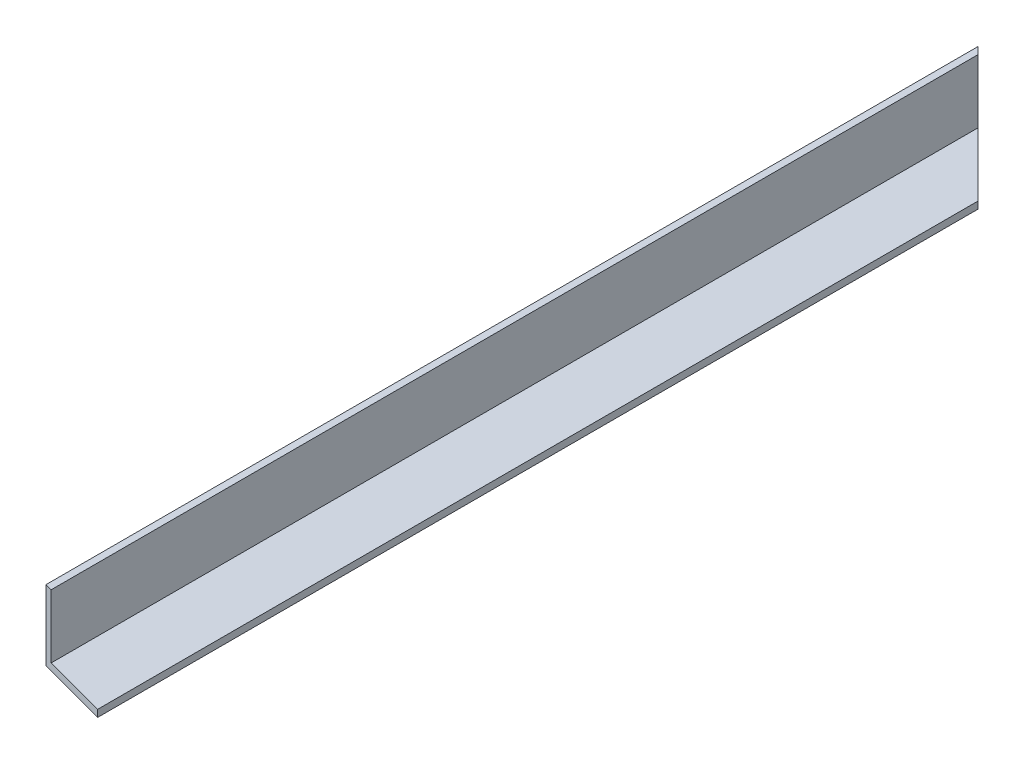
ISO-10303-21;
HEADER;
FILE_DESCRIPTION(('STEP AP214'),'2;1');
FILE_NAME('part.step','',(''),(''),'','','');
FILE_SCHEMA(('AUTOMOTIVE_DESIGN { 1 0 10303 214 1 1 1 1 }'));
ENDSEC;
DATA;
#1=APPLICATION_CONTEXT('core data for automotive mechanical design processes');
#2=APPLICATION_PROTOCOL_DEFINITION('international standard','automotive_design',2000,#1);
#3=PRODUCT_CONTEXT('',#1,'mechanical');
#4=PRODUCT('Part','Part','',(#3));
#5=PRODUCT_RELATED_PRODUCT_CATEGORY('part','',(#4));
#6=PRODUCT_DEFINITION_FORMATION('','',#4);
#7=PRODUCT_DEFINITION_CONTEXT('part definition',#1,'design');
#8=PRODUCT_DEFINITION('design','',#6,#7);
#9=PRODUCT_DEFINITION_SHAPE('','',#8);
#10=(LENGTH_UNIT() NAMED_UNIT(*) SI_UNIT(.MILLI.,.METRE.));
#11=(NAMED_UNIT(*) PLANE_ANGLE_UNIT() SI_UNIT($,.RADIAN.));
#12=(NAMED_UNIT(*) SI_UNIT($,.STERADIAN.) SOLID_ANGLE_UNIT());
#13=UNCERTAINTY_MEASURE_WITH_UNIT(LENGTH_MEASURE(1.E-05),#10,'distance_accuracy_value','');
#14=(GEOMETRIC_REPRESENTATION_CONTEXT(3) GLOBAL_UNCERTAINTY_ASSIGNED_CONTEXT((#13)) GLOBAL_UNIT_ASSIGNED_CONTEXT((#10,
#11,#12)) REPRESENTATION_CONTEXT('',''));
#15=CARTESIAN_POINT('',(0.,0.,0.));
#16=DIRECTION('',(0.,0.,1.));
#17=DIRECTION('',(1.,0.,0.));
#18=AXIS2_PLACEMENT_3D('',#15,#16,#17);
#19=CARTESIAN_POINT('',(12.7,0.,171.45));
#20=DIRECTION('',(0.,1.,0.));
#21=DIRECTION('',(-1.,0.,0.));
#22=AXIS2_PLACEMENT_3D('',#19,#20,#21);
#23=PLANE('',#22);
#24=DIRECTION('',(0.,0.,-1.));
#25=VECTOR('',#24,1.);
#26=CARTESIAN_POINT('',(0.,0.,171.45));
#27=LINE('',#26,#25);
#28=CARTESIAN_POINT('',(0.,0.,168.047045256125));
#29=VERTEX_POINT('',#28);
#30=CARTESIAN_POINT('',(0.,0.,0.));
#31=VERTEX_POINT('',#30);
#32=EDGE_CURVE('E115',#29,#31,#27,.T.);
#33=ORIENTED_EDGE('',*,*,#32,.T.);
#34=DIRECTION('',(0.707106781186552,0.,0.707106781186543));
#35=VECTOR('',#34,1.);
#36=CARTESIAN_POINT('',(0.,0.,0.));
#37=LINE('',#36,#35);
#38=CARTESIAN_POINT('',(12.7,0.,12.6999999999998));
#39=VERTEX_POINT('',#38);
#40=EDGE_CURVE('E92',#31,#39,#37,.T.);
#41=ORIENTED_EDGE('',*,*,#40,.T.);
#42=DIRECTION('',(0.,0.,-1.));
#43=VECTOR('',#42,1.);
#44=CARTESIAN_POINT('',(12.7,0.,171.45));
#45=LINE('',#44,#43);
#46=CARTESIAN_POINT('',(12.7,0.,171.45));
#47=VERTEX_POINT('',#46);
#48=EDGE_CURVE('E11',#47,#39,#45,.T.);
#49=ORIENTED_EDGE('',*,*,#48,.F.);
#50=DIRECTION('',(-0.96592582628907,0.,-0.258819045102514));
#51=VECTOR('',#50,1.);
#52=CARTESIAN_POINT('',(0.,0.,168.047045256125));
#53=LINE('',#52,#51);
#54=EDGE_CURVE('E53',#47,#29,#53,.T.);
#55=ORIENTED_EDGE('',*,*,#54,.T.);
#56=EDGE_LOOP('',(#33,#41,#49,#55));
#57=FACE_BOUND('',#56,.T.);
#58=ADVANCED_FACE('F38',(#57),#23,.F.);
#59=CARTESIAN_POINT('',(12.7,1.27,171.45));
#60=DIRECTION('',(-1.,0.,0.));
#61=DIRECTION('',(0.,0.,1.));
#62=AXIS2_PLACEMENT_3D('',#59,#60,#61);
#63=PLANE('',#62);
#64=ORIENTED_EDGE('',*,*,#48,.T.);
#65=DIRECTION('',(0.,1.,0.));
#66=VECTOR('',#65,1.);
#67=CARTESIAN_POINT('',(12.7,0.,12.6999999999998));
#68=LINE('',#67,#66);
#69=CARTESIAN_POINT('',(12.7,1.27,12.6999999999998));
#70=VERTEX_POINT('',#69);
#71=EDGE_CURVE('E138',#39,#70,#68,.T.);
#72=ORIENTED_EDGE('',*,*,#71,.T.);
#73=DIRECTION('',(0.,0.,-1.));
#74=VECTOR('',#73,1.);
#75=CARTESIAN_POINT('',(12.7,1.27,171.45));
#76=LINE('',#75,#74);
#77=CARTESIAN_POINT('',(12.7,1.27,171.45));
#78=VERTEX_POINT('',#77);
#79=EDGE_CURVE('E47',#78,#70,#76,.T.);
#80=ORIENTED_EDGE('',*,*,#79,.F.);
#81=DIRECTION('',(0.,1.,0.));
#82=VECTOR('',#81,1.);
#83=CARTESIAN_POINT('',(12.7,1.27,171.45));
#84=LINE('',#83,#82);
#85=EDGE_CURVE('E98',#47,#78,#84,.T.);
#86=ORIENTED_EDGE('',*,*,#85,.F.);
#87=EDGE_LOOP('',(#64,#72,#80,#86));
#88=FACE_BOUND('',#87,.T.);
#89=ADVANCED_FACE('F136',(#88),#63,.F.);
#90=CARTESIAN_POINT('',(1.27,1.27,171.45));
#91=DIRECTION('',(0.,-1.,0.));
#92=DIRECTION('',(1.,0.,0.));
#93=AXIS2_PLACEMENT_3D('',#90,#91,#92);
#94=PLANE('',#93);
#95=ORIENTED_EDGE('',*,*,#79,.T.);
#96=DIRECTION('',(-0.707106781186552,0.,-0.707106781186543));
#97=VECTOR('',#96,1.);
#98=CARTESIAN_POINT('',(86.36,1.27,86.359999999999));
#99=LINE('',#98,#97);
#100=CARTESIAN_POINT('',(1.27,1.27,1.26999999999997));
#101=VERTEX_POINT('',#100);
#102=EDGE_CURVE('E133',#70,#101,#99,.T.);
#103=ORIENTED_EDGE('',*,*,#102,.T.);
#104=DIRECTION('',(0.,0.,-1.));
#105=VECTOR('',#104,1.);
#106=CARTESIAN_POINT('',(1.27,1.27,171.45));
#107=LINE('',#106,#105);
#108=CARTESIAN_POINT('',(1.27,1.27,168.387340730512));
#109=VERTEX_POINT('',#108);
#110=EDGE_CURVE('E119',#109,#101,#107,.T.);
#111=ORIENTED_EDGE('',*,*,#110,.F.);
#112=DIRECTION('',(0.96592582628907,0.,0.258819045102514));
#113=VECTOR('',#112,1.);
#114=CARTESIAN_POINT('',(2.0356648173719,1.27,168.5925));
#115=LINE('',#114,#113);
#116=EDGE_CURVE('E99',#109,#78,#115,.T.);
#117=ORIENTED_EDGE('',*,*,#116,.T.);
#118=EDGE_LOOP('',(#95,#103,#111,#117));
#119=FACE_BOUND('',#118,.T.);
#120=ADVANCED_FACE('F131',(#119),#94,.F.);
#121=CARTESIAN_POINT('',(1.27,12.7,171.45));
#122=DIRECTION('',(-1.,0.,0.));
#123=DIRECTION('',(0.,-1.,0.));
#124=AXIS2_PLACEMENT_3D('',#121,#122,#123);
#125=PLANE('',#124);
#126=ORIENTED_EDGE('',*,*,#110,.T.);
#127=DIRECTION('',(0.,1.,0.));
#128=VECTOR('',#127,1.);
#129=CARTESIAN_POINT('',(1.27,12.7,1.26999999999997));
#130=LINE('',#129,#128);
#131=CARTESIAN_POINT('',(1.26999999999999,12.7,1.26999999999998));
#132=VERTEX_POINT('',#131);
#133=EDGE_CURVE('E140',#101,#132,#130,.T.);
#134=ORIENTED_EDGE('',*,*,#133,.T.);
#135=DIRECTION('',(0.,0.,-1.));
#136=VECTOR('',#135,1.);
#137=CARTESIAN_POINT('',(1.27,12.7,171.45));
#138=LINE('',#137,#136);
#139=CARTESIAN_POINT('',(1.27,12.7,168.387340730512));
#140=VERTEX_POINT('',#139);
#141=EDGE_CURVE('E108',#140,#132,#138,.T.);
#142=ORIENTED_EDGE('',*,*,#141,.F.);
#143=DIRECTION('',(0.,-1.,0.));
#144=VECTOR('',#143,1.);
#145=CARTESIAN_POINT('',(1.27,12.7,168.387340730512));
#146=LINE('',#145,#144);
#147=EDGE_CURVE('E156',#140,#109,#146,.T.);
#148=ORIENTED_EDGE('',*,*,#147,.T.);
#149=EDGE_LOOP('',(#126,#134,#142,#148));
#150=FACE_BOUND('',#149,.T.);
#151=ADVANCED_FACE('F165',(#150),#125,.F.);
#152=CARTESIAN_POINT('',(0.,12.7,171.45));
#153=DIRECTION('',(0.,-1.,0.));
#154=DIRECTION('',(0.,0.,-1.));
#155=AXIS2_PLACEMENT_3D('',#152,#153,#154);
#156=PLANE('',#155);
#157=ORIENTED_EDGE('',*,*,#141,.T.);
#158=DIRECTION('',(0.707106781186552,0.,0.707106781186543));
#159=VECTOR('',#158,1.);
#160=CARTESIAN_POINT('',(0.,12.7,0.));
#161=LINE('',#160,#159);
#162=CARTESIAN_POINT('',(0.,12.7,0.));
#163=VERTEX_POINT('',#162);
#164=EDGE_CURVE('E89',#163,#132,#161,.T.);
#165=ORIENTED_EDGE('',*,*,#164,.F.);
#166=DIRECTION('',(0.,0.,-1.));
#167=VECTOR('',#166,1.);
#168=CARTESIAN_POINT('',(0.,12.7,171.45));
#169=LINE('',#168,#167);
#170=CARTESIAN_POINT('',(0.,12.7,168.047045256125));
#171=VERTEX_POINT('',#170);
#172=EDGE_CURVE('E106',#171,#163,#169,.T.);
#173=ORIENTED_EDGE('',*,*,#172,.F.);
#174=DIRECTION('',(-0.96592582628907,0.,-0.258819045102514));
#175=VECTOR('',#174,1.);
#176=CARTESIAN_POINT('',(0.,12.7,168.047045256125));
#177=LINE('',#176,#175);
#178=EDGE_CURVE('E147',#140,#171,#177,.T.);
#179=ORIENTED_EDGE('',*,*,#178,.F.);
#180=EDGE_LOOP('',(#157,#165,#173,#179));
#181=FACE_BOUND('',#180,.T.);
#182=ADVANCED_FACE('F104',(#181),#156,.F.);
#183=CARTESIAN_POINT('',(0.,0.,171.45));
#184=DIRECTION('',(1.,0.,0.));
#185=DIRECTION('',(0.,0.,-1.));
#186=AXIS2_PLACEMENT_3D('',#183,#184,#185);
#187=PLANE('',#186);
#188=ORIENTED_EDGE('',*,*,#32,.F.);
#189=DIRECTION('',(0.,1.,0.));
#190=VECTOR('',#189,1.);
#191=CARTESIAN_POINT('',(0.,0.,168.047045256125));
#192=LINE('',#191,#190);
#193=EDGE_CURVE('E110',#29,#171,#192,.T.);
#194=ORIENTED_EDGE('',*,*,#193,.T.);
#195=ORIENTED_EDGE('',*,*,#172,.T.);
#196=DIRECTION('',(0.,-1.,0.));
#197=VECTOR('',#196,1.);
#198=CARTESIAN_POINT('',(0.,0.,0.));
#199=LINE('',#198,#197);
#200=EDGE_CURVE('E86',#163,#31,#199,.T.);
#201=ORIENTED_EDGE('',*,*,#200,.T.);
#202=EDGE_LOOP('',(#188,#194,#195,#201));
#203=FACE_BOUND('',#202,.T.);
#204=ADVANCED_FACE('F113',(#203),#187,.F.);
#205=CARTESIAN_POINT('',(0.,0.,0.));
#206=DIRECTION('',(-0.707106781186543,0.,0.707106781186552));
#207=DIRECTION('',(0.707106781186552,0.,0.707106781186543));
#208=AXIS2_PLACEMENT_3D('',#205,#206,#207);
#209=PLANE('',#208);
#210=ORIENTED_EDGE('',*,*,#71,.F.);
#211=ORIENTED_EDGE('',*,*,#40,.F.);
#212=ORIENTED_EDGE('',*,*,#200,.F.);
#213=ORIENTED_EDGE('',*,*,#164,.T.);
#214=ORIENTED_EDGE('',*,*,#133,.F.);
#215=ORIENTED_EDGE('',*,*,#102,.F.);
#216=EDGE_LOOP('',(#210,#211,#212,#213,#214,#215));
#217=FACE_BOUND('',#216,.T.);
#218=ADVANCED_FACE('F88',(#217),#209,.F.);
#219=CARTESIAN_POINT('',(0.,0.,168.047045256125));
#220=DIRECTION('',(0.258819045102514,0.,-0.96592582628907));
#221=DIRECTION('',(-0.96592582628907,0.,-0.258819045102514));
#222=AXIS2_PLACEMENT_3D('',#219,#220,#221);
#223=PLANE('',#222);
#224=ORIENTED_EDGE('',*,*,#147,.F.);
#225=ORIENTED_EDGE('',*,*,#178,.T.);
#226=ORIENTED_EDGE('',*,*,#193,.F.);
#227=ORIENTED_EDGE('',*,*,#54,.F.);
#228=ORIENTED_EDGE('',*,*,#85,.T.);
#229=ORIENTED_EDGE('',*,*,#116,.F.);
#230=EDGE_LOOP('',(#224,#225,#226,#227,#228,#229));
#231=FACE_BOUND('',#230,.T.);
#232=ADVANCED_FACE('F163',(#231),#223,.F.);
#233=CLOSED_SHELL('',(#58,#89,#120,#151,#182,#204,#218,#232));
#234=MANIFOLD_SOLID_BREP('B2',#233);
#235=ADVANCED_BREP_SHAPE_REPRESENTATION('',(#18,#234),#14);
#236=SHAPE_DEFINITION_REPRESENTATION(#9,#235);
ENDSEC;
END-ISO-10303-21;
